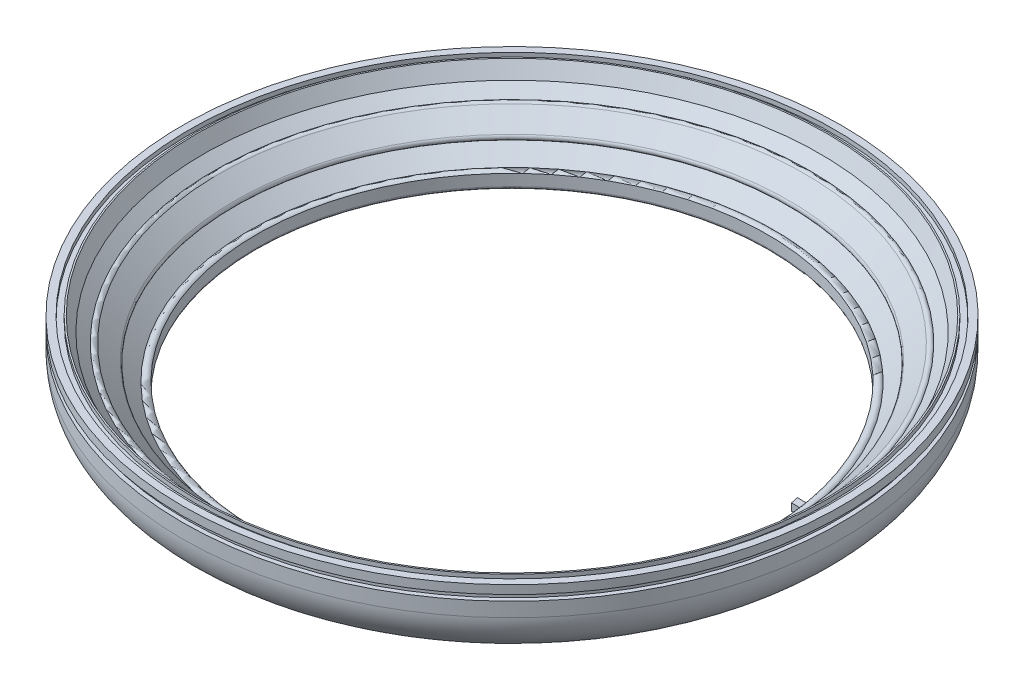
ISO-10303-21;
HEADER;
FILE_DESCRIPTION(('STEP AP214'),'2;1');
FILE_NAME('part.step','',(''),(''),'','','');
FILE_SCHEMA(('AUTOMOTIVE_DESIGN { 1 0 10303 214 1 1 1 1 }'));
ENDSEC;
DATA;
#1=APPLICATION_CONTEXT('core data for automotive mechanical design processes');
#2=APPLICATION_PROTOCOL_DEFINITION('international standard','automotive_design',2000,#1);
#3=PRODUCT_CONTEXT('',#1,'mechanical');
#4=PRODUCT('Part','Part','',(#3));
#5=PRODUCT_RELATED_PRODUCT_CATEGORY('part','',(#4));
#6=PRODUCT_DEFINITION_FORMATION('','',#4);
#7=PRODUCT_DEFINITION_CONTEXT('part definition',#1,'design');
#8=PRODUCT_DEFINITION('design','',#6,#7);
#9=PRODUCT_DEFINITION_SHAPE('','',#8);
#10=(LENGTH_UNIT() NAMED_UNIT(*) SI_UNIT(.MILLI.,.METRE.));
#11=(NAMED_UNIT(*) PLANE_ANGLE_UNIT() SI_UNIT($,.RADIAN.));
#12=(NAMED_UNIT(*) SI_UNIT($,.STERADIAN.) SOLID_ANGLE_UNIT());
#13=UNCERTAINTY_MEASURE_WITH_UNIT(LENGTH_MEASURE(1.E-05),#10,'distance_accuracy_value','');
#14=(GEOMETRIC_REPRESENTATION_CONTEXT(3) GLOBAL_UNCERTAINTY_ASSIGNED_CONTEXT((#13)) GLOBAL_UNIT_ASSIGNED_CONTEXT((#10,
#11,#12)) REPRESENTATION_CONTEXT('',''));
#15=CARTESIAN_POINT('',(0.,0.,0.));
#16=DIRECTION('',(0.,0.,1.));
#17=DIRECTION('',(1.,0.,0.));
#18=AXIS2_PLACEMENT_3D('',#15,#16,#17);
#19=CARTESIAN_POINT('',(0.,0.,0.));
#20=DIRECTION('',(0.,1.,0.));
#21=DIRECTION('',(0.,0.,1.));
#22=AXIS2_PLACEMENT_3D('',#19,#20,#21);
#23=PLANE('',#22);
#24=DIRECTION('',(0.214920145507512,0.,0.976631625053699));
#25=VECTOR('',#24,1.);
#26=CARTESIAN_POINT('',(16.4331558297115,0.,-3.61632385381236));
#27=LINE('',#26,#25);
#28=CARTESIAN_POINT('',(16.4691615119252,0.,-3.45270825673337));
#29=VERTEX_POINT('',#28);
#30=CARTESIAN_POINT('',(16.5835940910031,0.,-2.93270825673337));
#31=VERTEX_POINT('',#30);
#32=EDGE_CURVE('E53',#29,#31,#27,.T.);
#33=ORIENTED_EDGE('',*,*,#32,.F.);
#34=DIRECTION('',(-1.,0.,0.));
#35=VECTOR('',#34,1.);
#36=CARTESIAN_POINT('',(0.,0.,-3.45270825673337));
#37=LINE('',#36,#35);
#38=CARTESIAN_POINT('',(17.6561468967782,0.,-3.45270825673337));
#39=VERTEX_POINT('',#38);
#40=EDGE_CURVE('E109',#39,#29,#37,.T.);
#41=ORIENTED_EDGE('',*,*,#40,.F.);
#42=CARTESIAN_POINT('',(0.,0.,0.));
#43=DIRECTION('',(0.,-1.,0.));
#44=DIRECTION('',(0.,0.,-1.));
#45=AXIS2_PLACEMENT_3D('',#42,#43,#44);
#46=CIRCLE('',#45,17.9905730188543);
#47=CARTESIAN_POINT('',(17.7499278823215,0.,-2.93270825673337));
#48=VERTEX_POINT('',#47);
#49=EDGE_CURVE('E46',#48,#39,#46,.F.);
#50=ORIENTED_EDGE('',*,*,#49,.F.);
#51=DIRECTION('',(-1.,0.,0.));
#52=VECTOR('',#51,1.);
#53=CARTESIAN_POINT('',(0.,0.,-2.93270825673337));
#54=LINE('',#53,#52);
#55=EDGE_CURVE('E105',#48,#31,#54,.T.);
#56=ORIENTED_EDGE('',*,*,#55,.T.);
#57=EDGE_LOOP('',(#33,#41,#50,#56));
#58=FACE_BOUND('',#57,.T.);
#59=ADVANCED_FACE('F37',(#58),#23,.F.);
#60=CARTESIAN_POINT('',(0.,0.5,0.));
#61=DIRECTION('',(0.,1.,0.));
#62=DIRECTION('',(0.,0.,1.));
#63=AXIS2_PLACEMENT_3D('',#60,#61,#62);
#64=PLANE('',#63);
#65=DIRECTION('',(-1.,0.,0.));
#66=VECTOR('',#65,1.);
#67=CARTESIAN_POINT('',(0.,0.5,-3.45270825673337));
#68=LINE('',#67,#66);
#69=CARTESIAN_POINT('',(17.4890445469598,0.5,-3.45270825673337));
#70=VERTEX_POINT('',#69);
#71=CARTESIAN_POINT('',(16.4691615119252,0.5,-3.45270825673337));
#72=VERTEX_POINT('',#71);
#73=EDGE_CURVE('E95',#70,#72,#68,.T.);
#74=ORIENTED_EDGE('',*,*,#73,.T.);
#75=DIRECTION('',(0.214920145507512,0.,0.976631625053699));
#76=VECTOR('',#75,1.);
#77=CARTESIAN_POINT('',(16.4331558297115,0.5,-3.61632385381236));
#78=LINE('',#77,#76);
#79=CARTESIAN_POINT('',(16.5835940910031,0.5,-2.93270825673337));
#80=VERTEX_POINT('',#79);
#81=EDGE_CURVE('E82',#72,#80,#78,.T.);
#82=ORIENTED_EDGE('',*,*,#81,.T.);
#83=DIRECTION('',(-1.,0.,0.));
#84=VECTOR('',#83,1.);
#85=CARTESIAN_POINT('',(0.,0.5,-2.93270825673337));
#86=LINE('',#85,#84);
#87=CARTESIAN_POINT('',(17.5837167786718,0.5,-2.93270825673337));
#88=VERTEX_POINT('',#87);
#89=EDGE_CURVE('E93',#88,#80,#86,.T.);
#90=ORIENTED_EDGE('',*,*,#89,.F.);
#91=CARTESIAN_POINT('',(0.,0.5,0.));
#92=DIRECTION('',(0.,1.,0.));
#93=DIRECTION('',(0.,0.,1.));
#94=AXIS2_PLACEMENT_3D('',#91,#92,#93);
#95=CIRCLE('',#94,17.8266057754037);
#96=EDGE_CURVE('E286',#88,#70,#95,.T.);
#97=ORIENTED_EDGE('',*,*,#96,.T.);
#98=EDGE_LOOP('',(#74,#82,#90,#97));
#99=FACE_BOUND('',#98,.T.);
#100=ADVANCED_FACE('F91',(#99),#64,.T.);
#101=CARTESIAN_POINT('',(0.,0.5,-3.45270825673337));
#102=DIRECTION('',(0.,0.,1.));
#103=DIRECTION('',(1.,0.,0.));
#104=AXIS2_PLACEMENT_3D('',#101,#102,#103);
#105=PLANE('',#104);
#106=DIRECTION('',(0.,-1.,0.));
#107=VECTOR('',#106,1.);
#108=CARTESIAN_POINT('',(16.4691615119252,0.5,-3.45270825673337));
#109=LINE('',#108,#107);
#110=EDGE_CURVE('E112',#72,#29,#109,.T.);
#111=ORIENTED_EDGE('',*,*,#110,.F.);
#112=ORIENTED_EDGE('',*,*,#73,.F.);
#113=DIRECTION('',(0.,1.,0.));
#114=VECTOR('',#113,1.);
#115=CARTESIAN_POINT('',(17.4890445469598,2.8090333853554,-3.45270825673337));
#116=LINE('',#115,#114);
#117=CARTESIAN_POINT('',(17.4890445469598,0.196727325136713,-3.45270825673337));
#118=VERTEX_POINT('',#117);
#119=EDGE_CURVE('E220',#118,#70,#116,.T.);
#120=ORIENTED_EDGE('',*,*,#119,.F.);
#121=CARTESIAN_POINT('',(17.5038717636234,0.12184697390625,-3.45270825673337));
#122=CARTESIAN_POINT('',(17.4996681650671,0.13206232035388,-3.45270825673337));
#123=CARTESIAN_POINT('',(17.4963193664927,0.142637476261236,-3.45270825673337));
#124=CARTESIAN_POINT('',(17.4914418314301,0.164207922575979,-3.45270825673337));
#125=CARTESIAN_POINT('',(17.4899150071221,0.175203641904216,-3.45270825673337));
#126=CARTESIAN_POINT('',(17.4887341098721,0.197293117815655,-3.45270825673337));
#127=CARTESIAN_POINT('',(17.4890795112909,0.208386846009067,-3.45270825673337));
#128=CARTESIAN_POINT('',(17.4916311862743,0.230355297564105,-3.45270825673337));
#129=CARTESIAN_POINT('',(17.4938370596158,0.241230067512722,-3.45270825673337));
#130=CARTESIAN_POINT('',(17.5000354885648,0.26244252173755,-3.45270825673337));
#131=CARTESIAN_POINT('',(17.5040257978071,0.272780863100235,-3.45270825673337));
#132=CARTESIAN_POINT('',(17.5136696135595,0.292650099672163,-3.45270825673337));
#133=CARTESIAN_POINT('',(17.5193232292209,0.302180941837965,-3.45270825673337));
#134=CARTESIAN_POINT('',(17.5321856602566,0.320265497824091,-3.45270825673337));
#135=CARTESIAN_POINT('',(17.5394088267891,0.328808999116746,-3.45270825673337));
#136=CARTESIAN_POINT('',(17.5551648763752,0.344587621729161,-3.45270825673337));
#137=CARTESIAN_POINT('',(17.5636978664641,0.351822636017608,-3.45270825673337));
#138=CARTESIAN_POINT('',(17.5819881312223,0.36491299726694,-3.45270825673337));
#139=CARTESIAN_POINT('',(17.5917640159155,0.370742339138411,-3.45270825673337));
#140=CARTESIAN_POINT('',(17.6121428602851,0.380709747431873,-3.45270825673337));
#141=CARTESIAN_POINT('',(17.6227458978025,0.384847654448782,-3.45270825673337));
#142=CARTESIAN_POINT('',(17.6446768381166,0.391386951845146,-3.45270825673337));
#143=CARTESIAN_POINT('',(17.6560141664003,0.393756752219003,-3.45270825673337));
#144=CARTESIAN_POINT('',(17.6789251927249,0.396580639333895,-3.45270825673337));
#145=CARTESIAN_POINT('',(17.6904989074784,0.397034590149396,-3.45270825673337));
#146=CARTESIAN_POINT('',(17.7136785357294,0.396009700231893,-3.45270825673337));
#147=CARTESIAN_POINT('',(17.7252835881169,0.39451123734221,-3.45270825673337));
#148=CARTESIAN_POINT('',(17.7480770782516,0.389584515830308,-3.45270825673337));
#149=CARTESIAN_POINT('',(17.7592655113922,0.386156235876545,-3.45270825673337));
#150=CARTESIAN_POINT('',(17.7808850301204,0.377464445521522,-3.45270825673337));
#151=CARTESIAN_POINT('',(17.7913173074325,0.372203902302488,-3.45270825673337));
#152=CARTESIAN_POINT('',(17.8111354349425,0.359984649982236,-3.45270825673337));
#153=CARTESIAN_POINT('',(17.8205213449249,0.353026037973088,-3.45270825673337));
#154=CARTESIAN_POINT('',(17.8378497406368,0.337698241096462,-3.45270825673337));
#155=CARTESIAN_POINT('',(17.8458089563111,0.329347977451057,-3.45270825673337));
#156=CARTESIAN_POINT('',(17.8601814337968,0.311408509140959,-3.45270825673337));
#157=CARTESIAN_POINT('',(17.8665948520209,0.301819429977688,-3.45270825673337));
#158=CARTESIAN_POINT('',(17.8775714425752,0.281859400159133,-3.45270825673337));
#159=CARTESIAN_POINT('',(17.8821657750365,0.271505583898078,-3.45270825673337));
#160=CARTESIAN_POINT('',(17.8895202062811,0.250165842171606,-3.45270825673337));
#161=CARTESIAN_POINT('',(17.8922804817365,0.239179977701335,-3.45270825673337));
#162=CARTESIAN_POINT('',(17.8958502296357,0.217068287583363,-3.45270825673337));
#163=CARTESIAN_POINT('',(17.8966888360874,0.205947157913262,-3.45270825673337));
#164=CARTESIAN_POINT('',(17.8964746197256,0.183723437710166,-3.45270825673337));
#165=CARTESIAN_POINT('',(17.8954218901239,0.17262084629053,-3.45270825673337));
#166=CARTESIAN_POINT('',(17.8914705175146,0.150818268146917,-3.45270825673337));
#167=CARTESIAN_POINT('',(17.8885829295872,0.140116273948795,-3.45270825673337));
#168=CARTESIAN_POINT('',(17.8810618922205,0.119344907673376,-3.45270825673337));
#169=CARTESIAN_POINT('',(17.8764284176776,0.109275544694919,-3.45270825673337));
#170=CARTESIAN_POINT('',(17.8655253111343,0.0899902871672902,-3.45270825673337));
#171=CARTESIAN_POINT('',(17.8592465239563,0.0807795720818883,-3.45270825673337));
#172=CARTESIAN_POINT('',(17.8452527589209,0.0635233586367872,-3.45270825673337));
#173=CARTESIAN_POINT('',(17.8375376865376,0.0554779370303527,-3.45270825673337));
#174=CARTESIAN_POINT('',(17.8207702451759,0.0406512653387937,-3.45270825673337));
#175=CARTESIAN_POINT('',(17.8116997531276,0.0338905157037105,-3.45270825673337));
#176=CARTESIAN_POINT('',(17.7925687964827,0.0219563524151563,-3.45270825673337));
#177=CARTESIAN_POINT('',(17.7825082382385,0.0167830891083483,-3.45270825673337));
#178=CARTESIAN_POINT('',(17.7614908168933,0.00807511254709508,-3.45270825673337));
#179=CARTESIAN_POINT('',(17.750521186921,0.00457120536697389,-3.45270825673337));
#180=CARTESIAN_POINT('',(17.7281531357243,-0.00057251076894947,-3.45270825673337));
#181=CARTESIAN_POINT('',(17.7167546784331,-0.00221216256632934,-3.45270825673337));
#182=CARTESIAN_POINT('',(17.6936898298928,-0.00359651252584336,-3.45270825673337));
#183=CARTESIAN_POINT('',(17.6820218937743,-0.00331558971488353,-3.45270825673337));
#184=CARTESIAN_POINT('',(17.6588974883045,-0.000805534106194926,-3.45270825673337));
#185=CARTESIAN_POINT('',(17.6474410187282,0.00142359661751658,-3.45270825673337));
#186=CARTESIAN_POINT('',(17.6250318968887,0.0077828105527225,-3.45270825673337));
#187=CARTESIAN_POINT('',(17.6140807977908,0.0119183736936788,-3.45270825673337));
#188=CARTESIAN_POINT('',(17.5930343240792,0.0219869066924446,-3.45270825673337));
#189=CARTESIAN_POINT('',(17.5829391346505,0.0279202642582941,-3.45270825673337));
#190=CARTESIAN_POINT('',(17.5639927388858,0.0413661845669152,-3.45270825673337));
#191=CARTESIAN_POINT('',(17.5551316134631,0.0488647783869781,-3.45270825673337));
#192=CARTESIAN_POINT('',(17.5388305044355,0.0652616677478145,-3.45270825673337));
#193=CARTESIAN_POINT('',(17.5313886721112,0.0741581145463888,-3.45270825673337));
#194=CARTESIAN_POINT('',(17.5206041847228,0.0895873687094583,-3.45270825673337));
#195=CARTESIAN_POINT('',(17.5167632050671,0.0957780467584811,-3.45270825673337));
#196=CARTESIAN_POINT('',(17.5097817317786,0.108542751016782,-3.45270825673337));
#197=CARTESIAN_POINT('',(17.5066412304218,0.115116772998015,-3.45270825673337));
#198=CARTESIAN_POINT('',(17.5038717636234,0.12184697390625,-3.45270825673337));
#199=B_SPLINE_CURVE_WITH_KNOTS('',3,(#121,#122,#123,#124,#125,#126,#127,#128,#129,#130,#131,
#132,#133,#134,#135,#136,#137,#138,#139,#140,#141,#142,#143,#144,#145,#146,#147,#148,#149,#150,
#151,#152,#153,#154,#155,#156,#157,#158,#159,#160,#161,#162,#163,#164,#165,#166,#167,#168,#169,
#170,#171,#172,#173,#174,#175,#176,#177,#178,#179,#180,#181,#182,#183,#184,#185,#186,#187,#188,
#189,#190,#191,#192,#193,#194,#195,#196,#197,#198),.UNSPECIFIED.,.T.,.F.,(4,2,2,2,2,2,2,2,2,2,2,
2,2,2,2,2,2,2,2,2,2,2,2,2,2,2,2,2,2,2,2,2,2,2,2,2,2,2,4),(0.,0.0331129491055672,
0.0662606201044901,0.0993989851674676,0.132530223353623,0.16561987065811,0.198711689890558,
0.232119870417398,0.26553078242403,0.299519118517086,0.33351065701848,0.36809585001232,
0.402683496712291,0.437621452071483,0.472559793630605,0.507441816812165,0.542321845978738,
0.57676143557013,0.611197538901503,0.64501520303579,0.678829609088462,0.712127870840223,
0.745424491580062,0.778522377056511,0.811620738455438,0.844907334536587,0.87819612207789,
0.911978213846005,0.945763504040622,0.980150186981687,1.01453976853648,1.04938900299585,
1.08423820035558,1.11918820039448,1.15414574303778,1.18880371286126,1.22341622544702,
1.24523234874947,1.26704823147916),.UNSPECIFIED.);
#200=EDGE_CURVE('E103',#39,#118,#199,.T.);
#201=ORIENTED_EDGE('',*,*,#200,.F.);
#202=ORIENTED_EDGE('',*,*,#40,.T.);
#203=EDGE_LOOP('',(#111,#112,#120,#201,#202));
#204=FACE_BOUND('',#203,.T.);
#205=ADVANCED_FACE('F124',(#204),#105,.F.);
#206=CARTESIAN_POINT('',(0.,0.5,-2.93270825673337));
#207=DIRECTION('',(0.,0.,1.));
#208=DIRECTION('',(1.,0.,0.));
#209=AXIS2_PLACEMENT_3D('',#206,#207,#208);
#210=PLANE('',#209);
#211=ORIENTED_EDGE('',*,*,#89,.T.);
#212=DIRECTION('',(0.,-1.,0.));
#213=VECTOR('',#212,1.);
#214=CARTESIAN_POINT('',(16.5835940910031,0.5,-2.93270825673337));
#215=LINE('',#214,#213);
#216=EDGE_CURVE('E11',#80,#31,#215,.T.);
#217=ORIENTED_EDGE('',*,*,#216,.T.);
#218=ORIENTED_EDGE('',*,*,#55,.F.);
#219=CARTESIAN_POINT('',(17.6031250664997,0.111339060631053,-2.93270825673337));
#220=CARTESIAN_POINT('',(17.5983303262525,0.121357567453232,-2.93270825673337));
#221=CARTESIAN_POINT('',(17.5943739133204,0.131785715729165,-2.93270825673337));
#222=CARTESIAN_POINT('',(17.5882639229533,0.15316617040782,-2.93270825673337));
#223=CARTESIAN_POINT('',(17.5861122955318,0.164119030277228,-2.93270825673337));
#224=CARTESIAN_POINT('',(17.5836829798062,0.186228700838385,-2.93270825673337));
#225=CARTESIAN_POINT('',(17.5834047784039,0.197385454847694,-2.93270825673337));
#226=CARTESIAN_POINT('',(17.5847301022074,0.219583781277778,-2.93270825673337));
#227=CARTESIAN_POINT('',(17.5863332014682,0.230625379200078,-2.93270825673337));
#228=CARTESIAN_POINT('',(17.5913659398061,0.252261218087819,-2.93270825673337));
#229=CARTESIAN_POINT('',(17.594792031358,0.262856284929131,-2.93270825673337));
#230=CARTESIAN_POINT('',(17.603364853594,0.283325783962238,-2.93270825673337));
#231=CARTESIAN_POINT('',(17.6085116720735,0.293200179352377,-2.93270825673337));
#232=CARTESIAN_POINT('',(17.6204060799208,0.312009413802926,-2.93270825673337));
#233=CARTESIAN_POINT('',(17.6271624301503,0.320938710293973,-2.93270825673337));
#234=CARTESIAN_POINT('',(17.642062147705,0.337553016828918,-2.93270825673337));
#235=CARTESIAN_POINT('',(17.6502055912949,0.345237958410759,-2.93270825673337));
#236=CARTESIAN_POINT('',(17.6677506688317,0.359243859428499,-2.93270825673337));
#237=CARTESIAN_POINT('',(17.6771660909723,0.365547544362959,-2.93270825673337));
#238=CARTESIAN_POINT('',(17.696910850249,0.376508325420349,-2.93270825673337));
#239=CARTESIAN_POINT('',(17.7072402501253,0.381165308395538,-2.93270825673337));
#240=CARTESIAN_POINT('',(17.7286630301313,0.388761801006874,-2.93270825673337));
#241=CARTESIAN_POINT('',(17.7397645551529,0.391678348998594,-2.93270825673337));
#242=CARTESIAN_POINT('',(17.7622982817679,0.395623572280695,-2.93270825673337));
#243=CARTESIAN_POINT('',(17.7737305018799,0.396652141636942,-2.93270825673337));
#244=CARTESIAN_POINT('',(17.796702890659,0.396795137675234,-2.93270825673337));
#245=CARTESIAN_POINT('',(17.808243162996,0.395893495193993,-2.93270825673337));
#246=CARTESIAN_POINT('',(17.8310090566409,0.392166300847027,-2.93270825673337));
#247=CARTESIAN_POINT('',(17.8422346732734,0.389340720409677,-2.93270825673337));
#248=CARTESIAN_POINT('',(17.864052322687,0.381838893461648,-2.93270825673337));
#249=CARTESIAN_POINT('',(17.8746442391281,0.377162308320742,-2.93270825673337));
#250=CARTESIAN_POINT('',(17.8948838623238,0.366083417750589,-2.93270825673337));
#251=CARTESIAN_POINT('',(17.9045316008307,0.359681170381873,-2.93270825673337));
#252=CARTESIAN_POINT('',(17.9225232985512,0.345384310748318,-2.93270825673337));
#253=CARTESIAN_POINT('',(17.9308771036157,0.33750209304972,-2.93270825673337));
#254=CARTESIAN_POINT('',(17.9461220553137,0.320431129244309,-2.93270825673337));
#255=CARTESIAN_POINT('',(17.9530133020855,0.311242472658586,-2.93270825673337));
#256=CARTESIAN_POINT('',(17.9650444520772,0.29194370410296,-2.93270825673337));
#257=CARTESIAN_POINT('',(17.9702053816098,0.281846700332253,-2.93270825673337));
#258=CARTESIAN_POINT('',(17.9787358952521,0.260922370472788,-2.93270825673337));
#259=CARTESIAN_POINT('',(17.9821056067159,0.250095096367317,-2.93270825673337));
#260=CARTESIAN_POINT('',(17.9869204240167,0.228153051989533,-2.93270825673337));
#261=CARTESIAN_POINT('',(17.9883874564925,0.217043089542685,-2.93270825673337));
#262=CARTESIAN_POINT('',(17.9894238605985,0.19473519740583,-2.93270825673337));
#263=CARTESIAN_POINT('',(17.9889933126052,0.183537271461781,-2.93270825673337));
#264=CARTESIAN_POINT('',(17.9862557585328,0.161437212418728,-2.93270825673337));
#265=CARTESIAN_POINT('',(17.9839592549961,0.150533775779938,-2.93270825673337));
#266=CARTESIAN_POINT('',(17.9775731182259,0.129265649049959,-2.93270825673337));
#267=CARTESIAN_POINT('',(17.9734834798583,0.118900960501374,-2.93270825673337));
#268=CARTESIAN_POINT('',(17.9636202358031,0.0989714299028942,-2.93270825673337));
#269=CARTESIAN_POINT('',(17.9578420364903,0.0894088625356182,-2.93270825673337));
#270=CARTESIAN_POINT('',(17.9447769862093,0.0713772465611718,-2.93270825673337));
#271=CARTESIAN_POINT('',(17.9374900711329,0.0629082444465575,-2.93270825673337));
#272=CARTESIAN_POINT('',(17.9215397538848,0.0472131560788496,-2.93270825673337));
#273=CARTESIAN_POINT('',(17.9128635086727,0.040000124669408,-2.93270825673337));
#274=CARTESIAN_POINT('',(17.8944361508668,0.0271110766017527,-2.93270825673337));
#275=CARTESIAN_POINT('',(17.884684964899,0.0214351649568727,-2.93270825673337));
#276=CARTESIAN_POINT('',(17.8642506786283,0.0117050947923443,-2.93270825673337));
#277=CARTESIAN_POINT('',(17.8535572365262,0.00767265297002987,-2.93270825673337));
#278=CARTESIAN_POINT('',(17.8316491673871,0.00143935346524615,-2.93270825673337));
#279=CARTESIAN_POINT('',(17.8204345066897,-0.000761385750950705,-2.93270825673337));
#280=CARTESIAN_POINT('',(17.7976772081656,-0.00328820909936129,-2.93270825673337));
#281=CARTESIAN_POINT('',(17.7861323698564,-0.00359450797543181,-2.93270825673337));
#282=CARTESIAN_POINT('',(17.7631542288189,-0.00227194587525199,-2.93270825673337));
#283=CARTESIAN_POINT('',(17.7517209254727,-0.000643095622341415,-2.93270825673337));
#284=CARTESIAN_POINT('',(17.7292509183929,0.00451577929422016,-2.93270825673337));
#285=CARTESIAN_POINT('',(17.7182156674124,0.00805213796754877,-2.93270825673337));
#286=CARTESIAN_POINT('',(17.6968970726483,0.0169379658218097,-2.93270825673337));
#287=CARTESIAN_POINT('',(17.6866139037534,0.0222878551004689,-2.93270825673337));
#288=CARTESIAN_POINT('',(17.6671516115907,0.0346251517546511,-2.93270825673337));
#289=CARTESIAN_POINT('',(17.6579674551785,0.0416046250692212,-2.93270825673337));
#290=CARTESIAN_POINT('',(17.6409278846877,0.0570186289409702,-2.93270825673337));
#291=CARTESIAN_POINT('',(17.6330707988117,0.0654513013248933,-2.93270825673337));
#292=CARTESIAN_POINT('',(17.6215303422254,0.0801914373832344,-2.93270825673337));
#293=CARTESIAN_POINT('',(17.617376054701,0.0861365295442187,-2.93270825673337));
#294=CARTESIAN_POINT('',(17.6097372915704,0.098442664694935,-2.93270825673337));
#295=CARTESIAN_POINT('',(17.6062528113825,0.10480370483908,-2.93270825673337));
#296=CARTESIAN_POINT('',(17.6031250664997,0.111339060631053,-2.93270825673337));
#297=B_SPLINE_CURVE_WITH_KNOTS('',3,(#219,#220,#221,#222,#223,#224,#225,#226,#227,#228,#229,
#230,#231,#232,#233,#234,#235,#236,#237,#238,#239,#240,#241,#242,#243,#244,#245,#246,#247,#248,
#249,#250,#251,#252,#253,#254,#255,#256,#257,#258,#259,#260,#261,#262,#263,#264,#265,#266,#267,
#268,#269,#270,#271,#272,#273,#274,#275,#276,#277,#278,#279,#280,#281,#282,#283,#284,#285,#286,
#287,#288,#289,#290,#291,#292,#293,#294,#295,#296),.UNSPECIFIED.,.T.,.F.,(4,2,2,2,2,2,2,2,2,2,2,
2,2,2,2,2,2,2,2,2,2,2,2,2,2,2,2,2,2,2,2,2,2,2,2,2,2,2,4),(0.,0.0332940345137637,
0.0666239960082112,0.0999448286463877,0.133258118575597,0.166506816995271,0.199757212099637,
0.233192903410529,0.266630433665436,0.300464894409169,0.334301679525673,0.368575534927115,
0.40285131336948,0.437413549368711,0.471976298648947,0.506545373901964,0.541113286211065,
0.575403660366528,0.609691685974676,0.643546520908911,0.677398948471679,0.710857686015636,
0.744315006349538,0.777585305814091,0.810855700536659,0.84421746155049,0.877580640461614,
0.911272220397675,0.944966101503218,0.979091804182352,1.01321971378673,1.04770345658992,
1.0821870083075,1.11678577627831,1.15139256441016,1.18583424999994,1.22023221818966,
1.24195100858246,1.263669650408),.UNSPECIFIED.);
#298=CARTESIAN_POINT('',(17.5837167786718,0.196727325136713,-2.93270825673337));
#299=VERTEX_POINT('',#298);
#300=EDGE_CURVE('E101',#48,#299,#297,.T.);
#301=ORIENTED_EDGE('',*,*,#300,.T.);
#302=DIRECTION('',(0.,1.,0.));
#303=VECTOR('',#302,1.);
#304=CARTESIAN_POINT('',(17.5837167786718,2.8090333853554,-2.93270825673337));
#305=LINE('',#304,#303);
#306=EDGE_CURVE('E100',#299,#88,#305,.T.);
#307=ORIENTED_EDGE('',*,*,#306,.T.);
#308=EDGE_LOOP('',(#211,#217,#218,#301,#307));
#309=FACE_BOUND('',#308,.T.);
#310=ADVANCED_FACE('F98',(#309),#210,.T.);
#311=CARTESIAN_POINT('',(0.,0.196727325136713,0.));
#312=DIRECTION('',(0.,-1.,0.));
#313=DIRECTION('',(0.,0.,-1.));
#314=AXIS2_PLACEMENT_3D('',#311,#312,#313);
#315=TOROIDAL_SURFACE('',#314,18.0266057754037,0.2);
#316=CARTESIAN_POINT('',(0.,-0.00327267486328639,0.));
#317=DIRECTION('',(0.,-1.,0.));
#318=DIRECTION('',(0.,0.,-1.));
#319=AXIS2_PLACEMENT_3D('',#316,#317,#318);
#320=CIRCLE('',#319,18.0266057754037);
#321=CARTESIAN_POINT('',(0.,-0.00327267486328639,-18.0266057754037));
#322=VERTEX_POINT('',#321);
#323=EDGE_CURVE('E281',#322,#322,#320,.F.);
#324=ORIENTED_EDGE('',*,*,#323,.F.);
#325=EDGE_LOOP('',(#324));
#326=FACE_BOUND('',#325,.T.);
#327=ORIENTED_EDGE('',*,*,#49,.T.);
#328=ORIENTED_EDGE('',*,*,#200,.T.);
#329=CARTESIAN_POINT('',(0.,0.196727325136713,0.));
#330=DIRECTION('',(0.,-1.,0.));
#331=DIRECTION('',(0.,0.,-1.));
#332=AXIS2_PLACEMENT_3D('',#329,#330,#331);
#333=CIRCLE('',#332,17.8266057754037);
#334=EDGE_CURVE('E284',#299,#118,#333,.T.);
#335=ORIENTED_EDGE('',*,*,#334,.F.);
#336=ORIENTED_EDGE('',*,*,#300,.F.);
#337=EDGE_LOOP('',(#327,#328,#335,#336));
#338=FACE_BOUND('',#337,.T.);
#339=ADVANCED_FACE('F39',(#326,#338),#315,.T.);
#340=CARTESIAN_POINT('',(0.,2.8090333853554,0.));
#341=DIRECTION('',(0.,1.,0.));
#342=DIRECTION('',(0.,0.,1.));
#343=AXIS2_PLACEMENT_3D('',#340,#341,#342);
#344=CYLINDRICAL_SURFACE('',#343,17.8266057754037);
#345=CARTESIAN_POINT('',(0.,0.996727325136712,0.));
#346=DIRECTION('',(0.,1.,0.));
#347=DIRECTION('',(0.,0.,1.));
#348=AXIS2_PLACEMENT_3D('',#345,#346,#347);
#349=CIRCLE('',#348,17.8266057754037);
#350=CARTESIAN_POINT('',(0.,0.996727325136712,17.8266057754037));
#351=VERTEX_POINT('',#350);
#352=EDGE_CURVE('E223',#351,#351,#349,.T.);
#353=ORIENTED_EDGE('',*,*,#352,.T.);
#354=EDGE_LOOP('',(#353));
#355=FACE_BOUND('',#354,.T.);
#356=ORIENTED_EDGE('',*,*,#334,.T.);
#357=ORIENTED_EDGE('',*,*,#119,.T.);
#358=ORIENTED_EDGE('',*,*,#96,.F.);
#359=ORIENTED_EDGE('',*,*,#306,.F.);
#360=EDGE_LOOP('',(#356,#357,#358,#359));
#361=FACE_BOUND('',#360,.T.);
#362=ADVANCED_FACE('F130',(#355,#361),#344,.F.);
#363=CARTESIAN_POINT('',(0.,2.99672732513671,0.));
#364=DIRECTION('',(0.,-1.,0.));
#365=DIRECTION('',(0.,0.,-1.));
#366=AXIS2_PLACEMENT_3D('',#363,#364,#365);
#367=TOROIDAL_SURFACE('',#366,20.0091269280704,3.);
#368=CARTESIAN_POINT('',(0.,2.99672732513671,0.));
#369=DIRECTION('',(0.,-1.,0.));
#370=DIRECTION('',(0.,0.,-1.));
#371=AXIS2_PLACEMENT_3D('',#368,#369,#370);
#372=CIRCLE('',#371,23.0091269280704);
#373=CARTESIAN_POINT('',(0.,2.99672732513671,-23.0091269280704));
#374=VERTEX_POINT('',#373);
#375=EDGE_CURVE('E275',#374,#374,#372,.F.);
#376=ORIENTED_EDGE('',*,*,#375,.F.);
#377=EDGE_LOOP('',(#376));
#378=FACE_BOUND('',#377,.T.);
#379=CARTESIAN_POINT('',(0.,-0.00327267486328626,0.));
#380=DIRECTION('',(0.,-1.,0.));
#381=DIRECTION('',(0.,0.,-1.));
#382=AXIS2_PLACEMENT_3D('',#379,#380,#381);
#383=CIRCLE('',#382,20.0091269280704);
#384=CARTESIAN_POINT('',(0.,-0.00327267486328626,-20.0091269280704));
#385=VERTEX_POINT('',#384);
#386=EDGE_CURVE('E278',#385,#385,#383,.T.);
#387=ORIENTED_EDGE('',*,*,#386,.F.);
#388=EDGE_LOOP('',(#387));
#389=FACE_BOUND('',#388,.T.);
#390=ADVANCED_FACE('F133',(#378,#389),#367,.T.);
#391=CARTESIAN_POINT('',(-23.0091269280704,-0.0032726748632864,0.));
#392=DIRECTION('',(0.,-1.,0.));
#393=DIRECTION('',(0.,0.,-1.));
#394=AXIS2_PLACEMENT_3D('',#391,#392,#393);
#395=PLANE('',#394);
#396=ORIENTED_EDGE('',*,*,#323,.T.);
#397=EDGE_LOOP('',(#396));
#398=FACE_BOUND('',#397,.T.);
#399=ORIENTED_EDGE('',*,*,#386,.T.);
#400=EDGE_LOOP('',(#399));
#401=FACE_BOUND('',#400,.T.);
#402=ADVANCED_FACE('F202',(#398,#401),#395,.T.);
#403=CARTESIAN_POINT('',(0.,2.8090333853554,0.));
#404=DIRECTION('',(0.,1.,0.));
#405=DIRECTION('',(0.,0.,1.));
#406=AXIS2_PLACEMENT_3D('',#403,#404,#405);
#407=CYLINDRICAL_SURFACE('',#406,23.0091269280704);
#408=ORIENTED_EDGE('',*,*,#375,.T.);
#409=EDGE_LOOP('',(#408));
#410=FACE_BOUND('',#409,.T.);
#411=CARTESIAN_POINT('',(0.,3.99672732513671,0.));
#412=DIRECTION('',(0.,1.,0.));
#413=DIRECTION('',(0.,0.,1.));
#414=AXIS2_PLACEMENT_3D('',#411,#412,#413);
#415=CIRCLE('',#414,23.0091269280704);
#416=CARTESIAN_POINT('',(0.,3.99672732513671,23.0091269280704));
#417=VERTEX_POINT('',#416);
#418=EDGE_CURVE('E272',#417,#417,#415,.T.);
#419=ORIENTED_EDGE('',*,*,#418,.F.);
#420=EDGE_LOOP('',(#419));
#421=FACE_BOUND('',#420,.T.);
#422=ADVANCED_FACE('F198',(#410,#421),#407,.T.);
#423=CARTESIAN_POINT('',(-23.0091269280704,3.99672732513671,0.));
#424=DIRECTION('',(0.,1.,0.));
#425=DIRECTION('',(0.,0.,1.));
#426=AXIS2_PLACEMENT_3D('',#423,#424,#425);
#427=PLANE('',#426);
#428=ORIENTED_EDGE('',*,*,#418,.T.);
#429=EDGE_LOOP('',(#428));
#430=FACE_BOUND('',#429,.T.);
#431=CARTESIAN_POINT('',(0.,3.99672732513671,0.));
#432=DIRECTION('',(0.,1.,0.));
#433=DIRECTION('',(0.,0.,1.));
#434=AXIS2_PLACEMENT_3D('',#431,#432,#433);
#435=CIRCLE('',#434,22.7091269280704);
#436=CARTESIAN_POINT('',(0.,3.99672732513671,22.7091269280704));
#437=VERTEX_POINT('',#436);
#438=EDGE_CURVE('E269',#437,#437,#435,.T.);
#439=ORIENTED_EDGE('',*,*,#438,.F.);
#440=EDGE_LOOP('',(#439));
#441=FACE_BOUND('',#440,.T.);
#442=ADVANCED_FACE('F194',(#430,#441),#427,.T.);
#443=CARTESIAN_POINT('',(0.,2.8090333853554,0.));
#444=DIRECTION('',(0.,1.,0.));
#445=DIRECTION('',(0.,0.,1.));
#446=AXIS2_PLACEMENT_3D('',#443,#444,#445);
#447=CYLINDRICAL_SURFACE('',#446,22.7091269280704);
#448=ORIENTED_EDGE('',*,*,#438,.T.);
#449=EDGE_LOOP('',(#448));
#450=FACE_BOUND('',#449,.T.);
#451=CARTESIAN_POINT('',(0.,4.39672732513671,0.));
#452=DIRECTION('',(0.,1.,0.));
#453=DIRECTION('',(0.,0.,1.));
#454=AXIS2_PLACEMENT_3D('',#451,#452,#453);
#455=CIRCLE('',#454,22.7091269280704);
#456=CARTESIAN_POINT('',(0.,4.39672732513671,22.7091269280704));
#457=VERTEX_POINT('',#456);
#458=EDGE_CURVE('E266',#457,#457,#455,.T.);
#459=ORIENTED_EDGE('',*,*,#458,.F.);
#460=EDGE_LOOP('',(#459));
#461=FACE_BOUND('',#460,.T.);
#462=ADVANCED_FACE('F190',(#450,#461),#447,.T.);
#463=CARTESIAN_POINT('',(-22.7091269280704,4.39672732513671,0.));
#464=DIRECTION('',(0.,-1.,0.));
#465=DIRECTION('',(0.,0.,-1.));
#466=AXIS2_PLACEMENT_3D('',#463,#464,#465);
#467=PLANE('',#466);
#468=ORIENTED_EDGE('',*,*,#458,.T.);
#469=EDGE_LOOP('',(#468));
#470=FACE_BOUND('',#469,.T.);
#471=CARTESIAN_POINT('',(0.,4.39672732513671,0.));
#472=DIRECTION('',(0.,1.,0.));
#473=DIRECTION('',(0.,0.,1.));
#474=AXIS2_PLACEMENT_3D('',#471,#472,#473);
#475=CIRCLE('',#474,23.0091269280704);
#476=CARTESIAN_POINT('',(0.,4.39672732513671,23.0091269280704));
#477=VERTEX_POINT('',#476);
#478=EDGE_CURVE('E263',#477,#477,#475,.T.);
#479=ORIENTED_EDGE('',*,*,#478,.F.);
#480=EDGE_LOOP('',(#479));
#481=FACE_BOUND('',#480,.T.);
#482=ADVANCED_FACE('F186',(#470,#481),#467,.T.);
#483=CARTESIAN_POINT('',(0.,2.8090333853554,0.));
#484=DIRECTION('',(0.,1.,0.));
#485=DIRECTION('',(0.,0.,1.));
#486=AXIS2_PLACEMENT_3D('',#483,#484,#485);
#487=CYLINDRICAL_SURFACE('',#486,23.0091269280704);
#488=ORIENTED_EDGE('',*,*,#478,.T.);
#489=EDGE_LOOP('',(#488));
#490=FACE_BOUND('',#489,.T.);
#491=CARTESIAN_POINT('',(0.,4.99672732513671,0.));
#492=DIRECTION('',(0.,1.,0.));
#493=DIRECTION('',(0.,0.,1.));
#494=AXIS2_PLACEMENT_3D('',#491,#492,#493);
#495=CIRCLE('',#494,23.0091269280704);
#496=CARTESIAN_POINT('',(0.,4.99672732513671,23.0091269280704));
#497=VERTEX_POINT('',#496);
#498=EDGE_CURVE('E260',#497,#497,#495,.T.);
#499=ORIENTED_EDGE('',*,*,#498,.F.);
#500=EDGE_LOOP('',(#499));
#501=FACE_BOUND('',#500,.T.);
#502=ADVANCED_FACE('F182',(#490,#501),#487,.T.);
#503=CARTESIAN_POINT('',(-22.5112497778985,4.99672732513671,0.));
#504=DIRECTION('',(0.,1.,0.));
#505=DIRECTION('',(0.,0.,1.));
#506=AXIS2_PLACEMENT_3D('',#503,#504,#505);
#507=PLANE('',#506);
#508=ORIENTED_EDGE('',*,*,#498,.T.);
#509=EDGE_LOOP('',(#508));
#510=FACE_BOUND('',#509,.T.);
#511=CARTESIAN_POINT('',(0.,4.99672732513671,0.));
#512=DIRECTION('',(0.,1.,0.));
#513=DIRECTION('',(0.,0.,1.));
#514=AXIS2_PLACEMENT_3D('',#511,#512,#513);
#515=CIRCLE('',#514,22.5112497778985);
#516=CARTESIAN_POINT('',(0.,4.99672732513671,22.5112497778985));
#517=VERTEX_POINT('',#516);
#518=EDGE_CURVE('E257',#517,#517,#515,.T.);
#519=ORIENTED_EDGE('',*,*,#518,.F.);
#520=EDGE_LOOP('',(#519));
#521=FACE_BOUND('',#520,.T.);
#522=ADVANCED_FACE('F178',(#510,#521),#507,.T.);
#523=CARTESIAN_POINT('',(0.,2.8090333853554,0.));
#524=DIRECTION('',(0.,1.,0.));
#525=DIRECTION('',(0.,0.,1.));
#526=AXIS2_PLACEMENT_3D('',#523,#524,#525);
#527=CYLINDRICAL_SURFACE('',#526,22.5112497778985);
#528=ORIENTED_EDGE('',*,*,#518,.T.);
#529=EDGE_LOOP('',(#528));
#530=FACE_BOUND('',#529,.T.);
#531=CARTESIAN_POINT('',(0.,4.69672732513671,0.));
#532=DIRECTION('',(0.,1.,0.));
#533=DIRECTION('',(0.,0.,1.));
#534=AXIS2_PLACEMENT_3D('',#531,#532,#533);
#535=CIRCLE('',#534,22.5112497778985);
#536=CARTESIAN_POINT('',(0.,4.69672732513671,22.5112497778985));
#537=VERTEX_POINT('',#536);
#538=EDGE_CURVE('E254',#537,#537,#535,.T.);
#539=ORIENTED_EDGE('',*,*,#538,.F.);
#540=EDGE_LOOP('',(#539));
#541=FACE_BOUND('',#540,.T.);
#542=ADVANCED_FACE('F174',(#530,#541),#527,.F.);
#543=CARTESIAN_POINT('',(-22.5112497778985,4.69672732513671,0.));
#544=DIRECTION('',(0.,1.,0.));
#545=DIRECTION('',(0.,0.,1.));
#546=AXIS2_PLACEMENT_3D('',#543,#544,#545);
#547=PLANE('',#546);
#548=ORIENTED_EDGE('',*,*,#538,.T.);
#549=EDGE_LOOP('',(#548));
#550=FACE_BOUND('',#549,.T.);
#551=CARTESIAN_POINT('',(0.,4.69672732513671,0.));
#552=DIRECTION('',(0.,1.,0.));
#553=DIRECTION('',(0.,0.,1.));
#554=AXIS2_PLACEMENT_3D('',#551,#552,#553);
#555=CIRCLE('',#554,22.1121790850296);
#556=CARTESIAN_POINT('',(0.,4.69672732513671,22.1121790850296));
#557=VERTEX_POINT('',#556);
#558=EDGE_CURVE('E251',#557,#557,#555,.T.);
#559=ORIENTED_EDGE('',*,*,#558,.F.);
#560=EDGE_LOOP('',(#559));
#561=FACE_BOUND('',#560,.T.);
#562=ADVANCED_FACE('F170',(#550,#561),#547,.T.);
#563=CARTESIAN_POINT('',(0.,2.8090333853554,0.));
#564=DIRECTION('',(0.,1.,0.));
#565=DIRECTION('',(0.,0.,1.));
#566=AXIS2_PLACEMENT_3D('',#563,#564,#565);
#567=CYLINDRICAL_SURFACE('',#566,22.1121790850296);
#568=ORIENTED_EDGE('',*,*,#558,.T.);
#569=EDGE_LOOP('',(#568));
#570=FACE_BOUND('',#569,.T.);
#571=CARTESIAN_POINT('',(0.,4.99672732513671,0.));
#572=DIRECTION('',(0.,1.,0.));
#573=DIRECTION('',(0.,0.,1.));
#574=AXIS2_PLACEMENT_3D('',#571,#572,#573);
#575=CIRCLE('',#574,22.1121790850296);
#576=CARTESIAN_POINT('',(0.,4.99672732513671,22.1121790850296));
#577=VERTEX_POINT('',#576);
#578=EDGE_CURVE('E248',#577,#577,#575,.T.);
#579=ORIENTED_EDGE('',*,*,#578,.F.);
#580=EDGE_LOOP('',(#579));
#581=FACE_BOUND('',#580,.T.);
#582=ADVANCED_FACE('F166',(#570,#581),#567,.T.);
#583=CARTESIAN_POINT('',(-22.1121790850296,4.99672732513671,0.));
#584=DIRECTION('',(0.,1.,0.));
#585=DIRECTION('',(0.,0.,1.));
#586=AXIS2_PLACEMENT_3D('',#583,#584,#585);
#587=PLANE('',#586);
#588=ORIENTED_EDGE('',*,*,#578,.T.);
#589=EDGE_LOOP('',(#588));
#590=FACE_BOUND('',#589,.T.);
#591=CARTESIAN_POINT('',(0.,4.99672732513671,0.));
#592=DIRECTION('',(0.,1.,0.));
#593=DIRECTION('',(0.,0.,1.));
#594=AXIS2_PLACEMENT_3D('',#591,#592,#593);
#595=CIRCLE('',#594,22.0077493710078);
#596=CARTESIAN_POINT('',(0.,4.99672732513671,22.0077493710078));
#597=VERTEX_POINT('',#596);
#598=EDGE_CURVE('E245',#597,#597,#595,.T.);
#599=ORIENTED_EDGE('',*,*,#598,.F.);
#600=EDGE_LOOP('',(#599));
#601=FACE_BOUND('',#600,.T.);
#602=ADVANCED_FACE('F162',(#590,#601),#587,.T.);
#603=CARTESIAN_POINT('',(0.,4.00404459094041,0.));
#604=DIRECTION('',(0.,1.,0.));
#605=DIRECTION('',(0.,0.,1.));
#606=AXIS2_PLACEMENT_3D('',#603,#604,#605);
#607=CONICAL_SURFACE('',#606,21.5338496039383,0.445398980476274);
#608=ORIENTED_EDGE('',*,*,#598,.T.);
#609=EDGE_LOOP('',(#608));
#610=FACE_BOUND('',#609,.T.);
#611=CARTESIAN_POINT('',(0.,4.00404459094041,0.));
#612=DIRECTION('',(0.,1.,0.));
#613=DIRECTION('',(0.,0.,1.));
#614=AXIS2_PLACEMENT_3D('',#611,#612,#613);
#615=CIRCLE('',#614,21.5338496039383);
#616=CARTESIAN_POINT('',(0.,4.00404459094041,21.5338496039383));
#617=VERTEX_POINT('',#616);
#618=EDGE_CURVE('E242',#617,#617,#615,.T.);
#619=ORIENTED_EDGE('',*,*,#618,.F.);
#620=EDGE_LOOP('',(#619));
#621=FACE_BOUND('',#620,.T.);
#622=ADVANCED_FACE('F158',(#610,#621),#607,.F.);
#623=CARTESIAN_POINT('',(0.,3.33777599759894,0.));
#624=DIRECTION('',(0.,1.,0.));
#625=DIRECTION('',(0.,0.,1.));
#626=AXIS2_PLACEMENT_3D('',#623,#624,#625);
#627=CONICAL_SURFACE('',#626,20.8223301315545,0.818229496758383);
#628=ORIENTED_EDGE('',*,*,#618,.T.);
#629=EDGE_LOOP('',(#628));
#630=FACE_BOUND('',#629,.T.);
#631=CARTESIAN_POINT('',(0.,3.33777599759894,0.));
#632=DIRECTION('',(0.,1.,0.));
#633=DIRECTION('',(0.,0.,1.));
#634=AXIS2_PLACEMENT_3D('',#631,#632,#633);
#635=CIRCLE('',#634,20.8223301315545);
#636=CARTESIAN_POINT('',(0.,3.33777599759894,20.8223301315545));
#637=VERTEX_POINT('',#636);
#638=EDGE_CURVE('E239',#637,#637,#635,.T.);
#639=ORIENTED_EDGE('',*,*,#638,.F.);
#640=EDGE_LOOP('',(#639));
#641=FACE_BOUND('',#640,.T.);
#642=ADVANCED_FACE('F154',(#630,#641),#627,.F.);
#643=CARTESIAN_POINT('',(0.,3.15543378410986,0.));
#644=DIRECTION('',(0.,1.,0.));
#645=DIRECTION('',(0.,0.,1.));
#646=AXIS2_PLACEMENT_3D('',#643,#644,#645);
#647=TOROIDAL_SURFACE('',#646,20.6399879180654,0.257870831309387);
#648=ORIENTED_EDGE('',*,*,#638,.T.);
#649=EDGE_LOOP('',(#648));
#650=FACE_BOUND('',#649,.T.);
#651=CARTESIAN_POINT('',(0.,3.33777599759894,0.));
#652=DIRECTION('',(0.,1.,0.));
#653=DIRECTION('',(0.,0.,1.));
#654=AXIS2_PLACEMENT_3D('',#651,#652,#653);
#655=CIRCLE('',#654,20.4576457045764);
#656=CARTESIAN_POINT('',(0.,3.33777599759894,20.4576457045764));
#657=VERTEX_POINT('',#656);
#658=EDGE_CURVE('E236',#657,#657,#655,.T.);
#659=ORIENTED_EDGE('',*,*,#658,.F.);
#660=EDGE_LOOP('',(#659));
#661=FACE_BOUND('',#660,.T.);
#662=ADVANCED_FACE('F150',(#650,#661),#647,.T.);
#663=CARTESIAN_POINT('',(0.,2.28759092417574,0.));
#664=DIRECTION('',(0.,1.,0.));
#665=DIRECTION('',(0.,0.,1.));
#666=AXIS2_PLACEMENT_3D('',#663,#664,#665);
#667=CONICAL_SURFACE('',#666,19.3361353455185,0.818229496758383);
#668=ORIENTED_EDGE('',*,*,#658,.T.);
#669=EDGE_LOOP('',(#668));
#670=FACE_BOUND('',#669,.T.);
#671=CARTESIAN_POINT('',(0.,2.28759092417574,0.));
#672=DIRECTION('',(0.,1.,0.));
#673=DIRECTION('',(0.,0.,1.));
#674=AXIS2_PLACEMENT_3D('',#671,#672,#673);
#675=CIRCLE('',#674,19.3361353455185);
#676=CARTESIAN_POINT('',(0.,2.28759092417574,19.3361353455185));
#677=VERTEX_POINT('',#676);
#678=EDGE_CURVE('E233',#677,#677,#675,.T.);
#679=ORIENTED_EDGE('',*,*,#678,.F.);
#680=EDGE_LOOP('',(#679));
#681=FACE_BOUND('',#680,.T.);
#682=ADVANCED_FACE('F146',(#670,#681),#667,.F.);
#683=CARTESIAN_POINT('',(0.,2.11684522458003,0.));
#684=DIRECTION('',(0.,1.,0.));
#685=DIRECTION('',(0.,0.,1.));
#686=AXIS2_PLACEMENT_3D('',#683,#684,#685);
#687=TOROIDAL_SURFACE('',#686,19.5068810451142,0.241470884085141);
#688=ORIENTED_EDGE('',*,*,#678,.T.);
#689=EDGE_LOOP('',(#688));
#690=FACE_BOUND('',#689,.T.);
#691=CARTESIAN_POINT('',(0.,1.94609952498431,0.));
#692=DIRECTION('',(0.,1.,0.));
#693=DIRECTION('',(0.,0.,1.));
#694=AXIS2_PLACEMENT_3D('',#691,#692,#693);
#695=CIRCLE('',#694,19.3361353455185);
#696=CARTESIAN_POINT('',(0.,1.94609952498431,19.3361353455185));
#697=VERTEX_POINT('',#696);
#698=EDGE_CURVE('E228',#697,#697,#695,.T.);
#699=ORIENTED_EDGE('',*,*,#698,.F.);
#700=EDGE_LOOP('',(#699));
#701=FACE_BOUND('',#700,.T.);
#702=ADVANCED_FACE('F142',(#690,#701),#687,.T.);
#703=CARTESIAN_POINT('',(0.,0.996580203980246,0.));
#704=DIRECTION('',(0.,1.,0.));
#705=DIRECTION('',(0.,0.,1.));
#706=AXIS2_PLACEMENT_3D('',#703,#704,#705);
#707=CONICAL_SURFACE('',#706,18.3221276419425,0.818229496758383);
#708=ORIENTED_EDGE('',*,*,#698,.T.);
#709=EDGE_LOOP('',(#708));
#710=FACE_BOUND('',#709,.T.);
#711=CARTESIAN_POINT('',(0.,0.996580203980246,0.));
#712=DIRECTION('',(0.,1.,0.));
#713=DIRECTION('',(0.,0.,1.));
#714=AXIS2_PLACEMENT_3D('',#711,#712,#713);
#715=CIRCLE('',#714,18.3221276419425);
#716=CARTESIAN_POINT('',(0.,0.996580203980246,18.3221276419425));
#717=VERTEX_POINT('',#716);
#718=EDGE_CURVE('E225',#717,#717,#715,.T.);
#719=ORIENTED_EDGE('',*,*,#718,.F.);
#720=EDGE_LOOP('',(#719));
#721=FACE_BOUND('',#720,.T.);
#722=ADVANCED_FACE('F138',(#710,#721),#707,.F.);
#723=CARTESIAN_POINT('',(0.,0.76451171346137,0.));
#724=DIRECTION('',(0.,1.,0.));
#725=DIRECTION('',(0.,0.,1.));
#726=AXIS2_PLACEMENT_3D('',#723,#724,#725);
#727=TOROIDAL_SURFACE('',#726,18.0742977853635,0.339522344041835);
#728=ORIENTED_EDGE('',*,*,#718,.T.);
#729=EDGE_LOOP('',(#728));
#730=FACE_BOUND('',#729,.T.);
#731=ORIENTED_EDGE('',*,*,#352,.F.);
#732=EDGE_LOOP('',(#731));
#733=FACE_BOUND('',#732,.T.);
#734=ADVANCED_FACE('F135',(#730,#733),#727,.T.);
#735=CARTESIAN_POINT('',(16.6404113654373,81.5933764446965,-2.67452144539081));
#736=DIRECTION('',(-0.976631625053699,0.,0.214920145507512));
#737=DIRECTION('',(0.214920145507512,0.,0.976631625053699));
#738=AXIS2_PLACEMENT_3D('',#735,#736,#737);
#739=PLANE('',#738);
#740=ORIENTED_EDGE('',*,*,#81,.F.);
#741=ORIENTED_EDGE('',*,*,#110,.T.);
#742=ORIENTED_EDGE('',*,*,#32,.T.);
#743=ORIENTED_EDGE('',*,*,#216,.F.);
#744=EDGE_LOOP('',(#740,#741,#742,#743));
#745=FACE_BOUND('',#744,.T.);
#746=ADVANCED_FACE('F81',(#745),#739,.T.);
#747=CLOSED_SHELL('',(#59,#100,#205,#310,#339,#362,#390,#402,#422,#442,#462,#482,#502,#522,#542,
#562,#582,#602,#622,#642,#662,#682,#702,#722,#734,#746));
#748=MANIFOLD_SOLID_BREP('B2',#747);
#749=ADVANCED_BREP_SHAPE_REPRESENTATION('',(#18,#748),#14);
#750=SHAPE_DEFINITION_REPRESENTATION(#9,#749);
ENDSEC;
END-ISO-10303-21;
